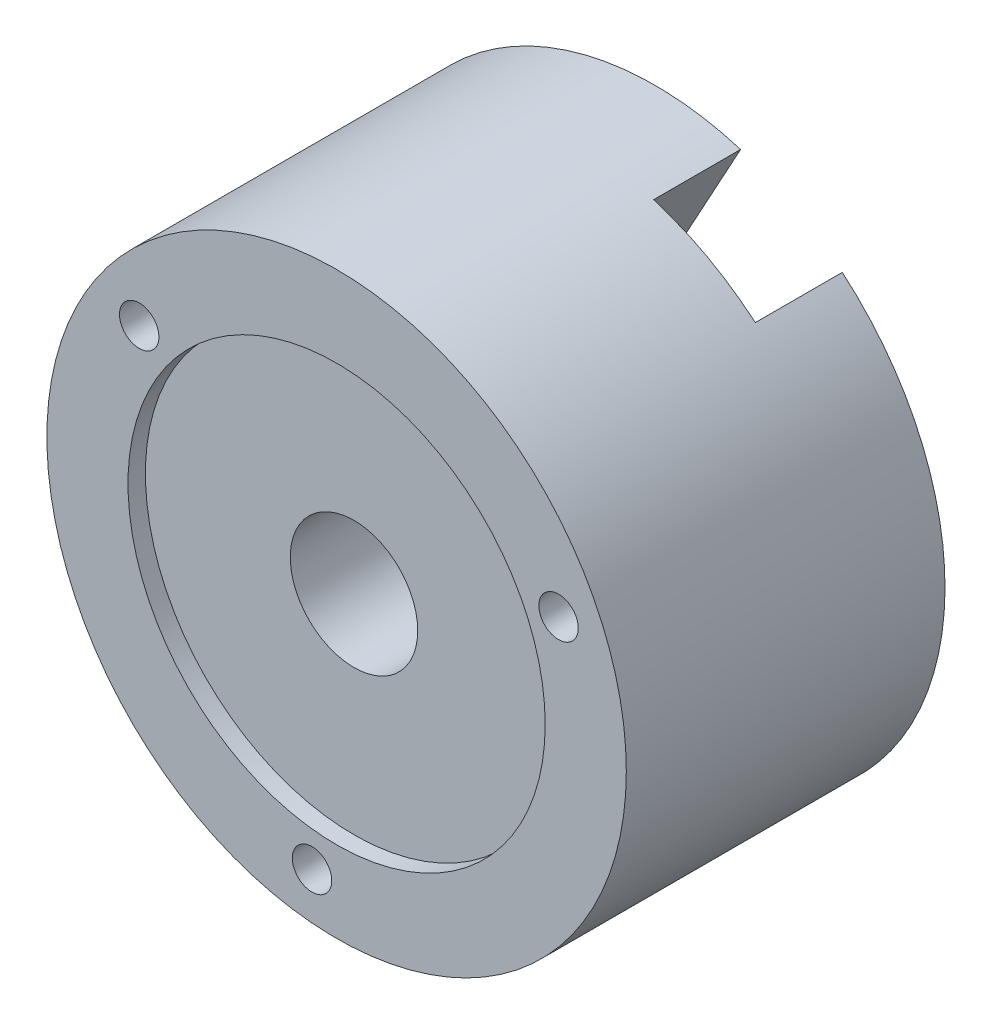
ISO-10303-21;
HEADER;
FILE_DESCRIPTION(('STEP AP214'),'2;1');
FILE_NAME('part.step','',(''),(''),'','','');
FILE_SCHEMA(('AUTOMOTIVE_DESIGN { 1 0 10303 214 1 1 1 1 }'));
ENDSEC;
DATA;
#1=APPLICATION_CONTEXT('core data for automotive mechanical design processes');
#2=APPLICATION_PROTOCOL_DEFINITION('international standard','automotive_design',2000,#1);
#3=PRODUCT_CONTEXT('',#1,'mechanical');
#4=PRODUCT('Part','Part','',(#3));
#5=PRODUCT_RELATED_PRODUCT_CATEGORY('part','',(#4));
#6=PRODUCT_DEFINITION_FORMATION('','',#4);
#7=PRODUCT_DEFINITION_CONTEXT('part definition',#1,'design');
#8=PRODUCT_DEFINITION('design','',#6,#7);
#9=PRODUCT_DEFINITION_SHAPE('','',#8);
#10=(LENGTH_UNIT() NAMED_UNIT(*) SI_UNIT(.MILLI.,.METRE.));
#11=(NAMED_UNIT(*) PLANE_ANGLE_UNIT() SI_UNIT($,.RADIAN.));
#12=(NAMED_UNIT(*) SI_UNIT($,.STERADIAN.) SOLID_ANGLE_UNIT());
#13=UNCERTAINTY_MEASURE_WITH_UNIT(LENGTH_MEASURE(1.E-05),#10,'distance_accuracy_value','');
#14=(GEOMETRIC_REPRESENTATION_CONTEXT(3) GLOBAL_UNCERTAINTY_ASSIGNED_CONTEXT((#13)) GLOBAL_UNIT_ASSIGNED_CONTEXT((#10,
#11,#12)) REPRESENTATION_CONTEXT('',''));
#15=CARTESIAN_POINT('',(0.,0.,0.));
#16=DIRECTION('',(0.,0.,1.));
#17=DIRECTION('',(1.,0.,0.));
#18=AXIS2_PLACEMENT_3D('',#15,#16,#17);
#19=CARTESIAN_POINT('',(0.,0.,0.));
#20=DIRECTION('',(0.,0.,1.));
#21=DIRECTION('',(1.,0.,0.));
#22=AXIS2_PLACEMENT_3D('',#19,#20,#21);
#23=PLANE('',#22);
#24=CARTESIAN_POINT('',(0.,0.,0.));
#25=DIRECTION('',(0.,0.,1.));
#26=DIRECTION('',(1.,0.,0.));
#27=AXIS2_PLACEMENT_3D('',#24,#25,#26);
#28=CIRCLE('',#27,50.);
#29=CARTESIAN_POINT('',(34.0235840809207,-36.6387189498831,0.));
#30=VERTEX_POINT('',#29);
#31=CARTESIAN_POINT('',(32.2684884576599,38.1935158457279,0.));
#32=VERTEX_POINT('',#31);
#33=EDGE_CURVE('E208',#30,#32,#28,.T.);
#34=ORIENTED_EDGE('',*,*,#33,.F.);
#35=DIRECTION('',(0.520168485951958,-0.854063666375317,0.));
#36=VECTOR('',#35,1.);
#37=CARTESIAN_POINT('',(60.5574852589489,-80.2046817780121,0.));
#38=LINE('',#37,#36);
#39=CARTESIAN_POINT('',(11.5438308176364,0.270745982650838,0.));
#40=VERTEX_POINT('',#39);
#41=EDGE_CURVE('E128',#40,#30,#38,.T.);
#42=ORIENTED_EDGE('',*,*,#41,.F.);
#43=DIRECTION('',(-0.479556588554331,-0.877510956270138,0.));
#44=VECTOR('',#43,1.);
#45=CARTESIAN_POINT('',(56.7307684181345,82.9555297414705,0.));
#46=LINE('',#45,#44);
#47=EDGE_CURVE('E157',#32,#40,#46,.T.);
#48=ORIENTED_EDGE('',*,*,#47,.F.);
#49=EDGE_LOOP('',(#34,#42,#48));
#50=FACE_BOUND('',#49,.T.);
#51=ADVANCED_FACE('F39',(#50),#23,.F.);
#52=CARTESIAN_POINT('',(14.7182693322572,47.7846476168145,0.));
#53=VERTEX_POINT('',#52);
#54=CARTESIAN_POINT('',(-49.2107992110739,8.84857282319423,0.));
#55=VERTEX_POINT('',#54);
#56=EDGE_CURVE('E48',#53,#55,#28,.T.);
#57=ORIENTED_EDGE('',*,*,#56,.F.);
#58=DIRECTION('',(0.479556588554331,0.877510956270138,0.));
#59=VECTOR('',#58,1.);
#60=CARTESIAN_POINT('',(39.1805492927317,92.5466615125571,0.));
#61=LINE('',#60,#59);
#62=CARTESIAN_POINT('',(-6.00638830776638,9.86187775373735,0.));
#63=VERTEX_POINT('',#62);
#64=EDGE_CURVE('E155',#63,#53,#61,.T.);
#65=ORIENTED_EDGE('',*,*,#64,.F.);
#66=DIRECTION('',(0.99972507450628,0.0234472898948206,0.));
#67=VECTOR('',#66,1.);
#68=CARTESIAN_POINT('',(-100.206980349576,7.65252175558071,0.));
#69=LINE('',#68,#67);
#70=EDGE_CURVE('E153',#55,#63,#69,.T.);
#71=ORIENTED_EDGE('',*,*,#70,.F.);
#72=EDGE_LOOP('',(#57,#65,#71));
#73=FACE_BOUND('',#72,.T.);
#74=ADVANCED_FACE('F222',(#73),#23,.F.);
#75=CARTESIAN_POINT('',(0.,0.,-0.001000000000001));
#76=DIRECTION('',(0.,0.,1.));
#77=DIRECTION('',(1.,0.,0.));
#78=AXIS2_PLACEMENT_3D('',#75,#76,#77);
#79=CYLINDRICAL_SURFACE('',#78,11.);
#80=CARTESIAN_POINT('',(0.,0.,52.));
#81=DIRECTION('',(0.,0.,1.));
#82=DIRECTION('',(1.,0.,0.));
#83=AXIS2_PLACEMENT_3D('',#80,#81,#82);
#84=CIRCLE('',#83,11.);
#85=CARTESIAN_POINT('',(11.,0.,52.));
#86=VERTEX_POINT('',#85);
#87=EDGE_CURVE('E201',#86,#86,#84,.T.);
#88=ORIENTED_EDGE('',*,*,#87,.T.);
#89=EDGE_LOOP('',(#88));
#90=FACE_BOUND('',#89,.T.);
#91=CARTESIAN_POINT('',(0.,0.,15.));
#92=DIRECTION('',(0.,0.,-1.));
#93=DIRECTION('',(-1.,0.,0.));
#94=AXIS2_PLACEMENT_3D('',#91,#92,#93);
#95=CIRCLE('',#94,11.);
#96=CARTESIAN_POINT('',(-11.,0.,15.));
#97=VERTEX_POINT('',#96);
#98=EDGE_CURVE('E43',#97,#97,#95,.F.);
#99=ORIENTED_EDGE('',*,*,#98,.F.);
#100=EDGE_LOOP('',(#99));
#101=FACE_BOUND('',#100,.T.);
#102=ADVANCED_FACE('F257',(#90,#101),#79,.F.);
#103=CARTESIAN_POINT('',(0.,0.,55.));
#104=DIRECTION('',(0.,0.,-1.));
#105=DIRECTION('',(-1.,0.,0.));
#106=AXIS2_PLACEMENT_3D('',#103,#104,#105);
#107=CYLINDRICAL_SURFACE('',#106,50.);
#108=ORIENTED_EDGE('',*,*,#33,.T.);
#109=DIRECTION('',(0.,0.,-1.));
#110=VECTOR('',#109,1.);
#111=CARTESIAN_POINT('',(32.2684884576599,38.1935158457279,55.));
#112=LINE('',#111,#110);
#113=CARTESIAN_POINT('',(32.2684884576599,38.1935158457279,15.));
#114=VERTEX_POINT('',#113);
#115=EDGE_CURVE('E175',#32,#114,#112,.F.);
#116=ORIENTED_EDGE('',*,*,#115,.T.);
#117=CARTESIAN_POINT('',(0.,0.,15.));
#118=DIRECTION('',(0.,0.,-1.));
#119=DIRECTION('',(-1.,0.,0.));
#120=AXIS2_PLACEMENT_3D('',#117,#118,#119);
#121=CIRCLE('',#120,50.);
#122=CARTESIAN_POINT('',(14.7182693322572,47.7846476168145,15.));
#123=VERTEX_POINT('',#122);
#124=EDGE_CURVE('E167',#123,#114,#121,.T.);
#125=ORIENTED_EDGE('',*,*,#124,.F.);
#126=DIRECTION('',(0.,0.,-1.));
#127=VECTOR('',#126,1.);
#128=CARTESIAN_POINT('',(14.7182693322572,47.7846476168145,55.));
#129=LINE('',#128,#127);
#130=EDGE_CURVE('E172',#123,#53,#129,.T.);
#131=ORIENTED_EDGE('',*,*,#130,.T.);
#132=ORIENTED_EDGE('',*,*,#56,.T.);
#133=DIRECTION('',(0.,0.,-1.));
#134=VECTOR('',#133,1.);
#135=CARTESIAN_POINT('',(-49.2107992110739,8.84857282319423,55.));
#136=LINE('',#135,#134);
#137=CARTESIAN_POINT('',(-49.2107992110739,8.84857282319423,15.));
#138=VERTEX_POINT('',#137);
#139=EDGE_CURVE('E169',#55,#138,#136,.F.);
#140=ORIENTED_EDGE('',*,*,#139,.T.);
#141=CARTESIAN_POINT('',(-48.7418534131775,-11.1459286669314,15.));
#142=VERTEX_POINT('',#141);
#143=EDGE_CURVE('E165',#142,#138,#121,.T.);
#144=ORIENTED_EDGE('',*,*,#143,.F.);
#145=DIRECTION('',(0.,0.,-1.));
#146=VECTOR('',#145,1.);
#147=CARTESIAN_POINT('',(-48.7418534131774,-11.1459286669314,55.));
#148=LINE('',#147,#146);
#149=CARTESIAN_POINT('',(-48.7418534131775,-11.1459286669314,0.));
#150=VERTEX_POINT('',#149);
#151=EDGE_CURVE('E139',#142,#150,#148,.T.);
#152=ORIENTED_EDGE('',*,*,#151,.T.);
#153=CARTESIAN_POINT('',(16.9423107534144,-47.0420886689222,0.));
#154=VERTEX_POINT('',#153);
#155=EDGE_CURVE('E211',#150,#154,#28,.T.);
#156=ORIENTED_EDGE('',*,*,#155,.T.);
#157=DIRECTION('',(0.,0.,-1.));
#158=VECTOR('',#157,1.);
#159=CARTESIAN_POINT('',(16.9423107534143,-47.0420886689222,55.));
#160=LINE('',#159,#158);
#161=CARTESIAN_POINT('',(16.9423107534143,-47.0420886689222,15.));
#162=VERTEX_POINT('',#161);
#163=EDGE_CURVE('E181',#154,#162,#160,.F.);
#164=ORIENTED_EDGE('',*,*,#163,.T.);
#165=CARTESIAN_POINT('',(34.0235840809207,-36.6387189498831,15.));
#166=VERTEX_POINT('',#165);
#167=EDGE_CURVE('E125',#166,#162,#121,.T.);
#168=ORIENTED_EDGE('',*,*,#167,.F.);
#169=DIRECTION('',(0.,0.,-1.));
#170=VECTOR('',#169,1.);
#171=CARTESIAN_POINT('',(34.0235840809207,-36.6387189498831,55.));
#172=LINE('',#171,#170);
#173=EDGE_CURVE('E178',#166,#30,#172,.T.);
#174=ORIENTED_EDGE('',*,*,#173,.T.);
#175=EDGE_LOOP('',(#108,#116,#125,#131,#132,#140,#144,#152,#156,#164,#168,#174));
#176=FACE_BOUND('',#175,.T.);
#177=CARTESIAN_POINT('',(0.,0.,55.));
#178=DIRECTION('',(0.,0.,1.));
#179=DIRECTION('',(1.,0.,0.));
#180=AXIS2_PLACEMENT_3D('',#177,#178,#179);
#181=CIRCLE('',#180,50.);
#182=CARTESIAN_POINT('',(50.,0.,55.));
#183=VERTEX_POINT('',#182);
#184=EDGE_CURVE('E11',#183,#183,#181,.T.);
#185=ORIENTED_EDGE('',*,*,#184,.F.);
#186=EDGE_LOOP('',(#185));
#187=FACE_BOUND('',#186,.T.);
#188=ADVANCED_FACE('F41',(#176,#187),#107,.T.);
#189=CARTESIAN_POINT('',(0.,0.,55.));
#190=DIRECTION('',(0.,0.,1.));
#191=DIRECTION('',(1.,0.,0.));
#192=AXIS2_PLACEMENT_3D('',#189,#190,#191);
#193=PLANE('',#192);
#194=CARTESIAN_POINT('',(-34.0686775954448,24.5626791473902,55.));
#195=DIRECTION('',(0.,0.,1.));
#196=DIRECTION('',(1.,0.,0.));
#197=AXIS2_PLACEMENT_3D('',#194,#195,#196);
#198=CIRCLE('',#197,3.39999999999999);
#199=CARTESIAN_POINT('',(-30.6686775954448,24.5626791473902,55.));
#200=VERTEX_POINT('',#199);
#201=EDGE_CURVE('E183',#200,#200,#198,.T.);
#202=ORIENTED_EDGE('',*,*,#201,.F.);
#203=EDGE_LOOP('',(#202));
#204=FACE_BOUND('',#203,.T.);
#205=CARTESIAN_POINT('',(38.3062429243689,17.2230006973048,55.));
#206=DIRECTION('',(0.,0.,1.));
#207=DIRECTION('',(1.,0.,0.));
#208=AXIS2_PLACEMENT_3D('',#205,#206,#207);
#209=CIRCLE('',#208,3.39999999999999);
#210=CARTESIAN_POINT('',(41.7062429243689,17.2230006973048,55.));
#211=VERTEX_POINT('',#210);
#212=EDGE_CURVE('E189',#211,#211,#209,.T.);
#213=ORIENTED_EDGE('',*,*,#212,.F.);
#214=EDGE_LOOP('',(#213));
#215=FACE_BOUND('',#214,.T.);
#216=CARTESIAN_POINT('',(-4.23756532892108,-41.7856798446908,55.));
#217=DIRECTION('',(0.,0.,1.));
#218=DIRECTION('',(1.,0.,0.));
#219=AXIS2_PLACEMENT_3D('',#216,#217,#218);
#220=CIRCLE('',#219,3.39999999999999);
#221=CARTESIAN_POINT('',(-0.837565328921088,-41.7856798446908,55.));
#222=VERTEX_POINT('',#221);
#223=EDGE_CURVE('E195',#222,#222,#220,.T.);
#224=ORIENTED_EDGE('',*,*,#223,.F.);
#225=EDGE_LOOP('',(#224));
#226=FACE_BOUND('',#225,.T.);
#227=CARTESIAN_POINT('',(0.,0.,55.));
#228=DIRECTION('',(0.,0.,1.));
#229=DIRECTION('',(1.,0.,0.));
#230=AXIS2_PLACEMENT_3D('',#227,#228,#229);
#231=CIRCLE('',#230,36.);
#232=CARTESIAN_POINT('',(36.,0.,55.));
#233=VERTEX_POINT('',#232);
#234=EDGE_CURVE('E204',#233,#233,#231,.T.);
#235=ORIENTED_EDGE('',*,*,#234,.F.);
#236=EDGE_LOOP('',(#235));
#237=FACE_BOUND('',#236,.T.);
#238=ORIENTED_EDGE('',*,*,#184,.T.);
#239=EDGE_LOOP('',(#238));
#240=FACE_BOUND('',#239,.T.);
#241=ADVANCED_FACE('F245',(#204,#215,#226,#237,#240),#193,.T.);
#242=DIRECTION('',(-0.999725074506281,-0.0234472898948211,0.));
#243=VECTOR('',#242,1.);
#244=CARTESIAN_POINT('',(-99.7380345516799,-12.3419797345449,0.));
#245=LINE('',#244,#243);
#246=CARTESIAN_POINT('',(-5.53744250986993,-10.1326237363882,0.));
#247=VERTEX_POINT('',#246);
#248=EDGE_CURVE('E151',#247,#150,#245,.T.);
#249=ORIENTED_EDGE('',*,*,#248,.F.);
#250=DIRECTION('',(-0.520168485951957,0.854063666375317,0.));
#251=VECTOR('',#250,1.);
#252=CARTESIAN_POINT('',(43.4762119314426,-90.6080514970512,0.));
#253=LINE('',#252,#251);
#254=EDGE_CURVE('E132',#154,#247,#253,.T.);
#255=ORIENTED_EDGE('',*,*,#254,.F.);
#256=ORIENTED_EDGE('',*,*,#155,.F.);
#257=EDGE_LOOP('',(#249,#255,#256));
#258=FACE_BOUND('',#257,.T.);
#259=ADVANCED_FACE('F242',(#258),#23,.F.);
#260=CARTESIAN_POINT('',(0.,0.,52.));
#261=DIRECTION('',(0.,0.,1.));
#262=DIRECTION('',(1.,0.,0.));
#263=AXIS2_PLACEMENT_3D('',#260,#261,#262);
#264=CYLINDRICAL_SURFACE('',#263,36.);
#265=CARTESIAN_POINT('',(0.,0.,52.));
#266=DIRECTION('',(0.,0.,1.));
#267=DIRECTION('',(1.,0.,0.));
#268=AXIS2_PLACEMENT_3D('',#265,#266,#267);
#269=CIRCLE('',#268,36.);
#270=CARTESIAN_POINT('',(36.,0.,52.));
#271=VERTEX_POINT('',#270);
#272=EDGE_CURVE('E205',#271,#271,#269,.T.);
#273=ORIENTED_EDGE('',*,*,#272,.F.);
#274=EDGE_LOOP('',(#273));
#275=FACE_BOUND('',#274,.T.);
#276=ORIENTED_EDGE('',*,*,#234,.T.);
#277=EDGE_LOOP('',(#276));
#278=FACE_BOUND('',#277,.T.);
#279=ADVANCED_FACE('F244',(#275,#278),#264,.F.);
#280=CARTESIAN_POINT('',(0.,0.,52.));
#281=DIRECTION('',(0.,0.,1.));
#282=DIRECTION('',(1.,0.,0.));
#283=AXIS2_PLACEMENT_3D('',#280,#281,#282);
#284=PLANE('',#283);
#285=ORIENTED_EDGE('',*,*,#87,.F.);
#286=EDGE_LOOP('',(#285));
#287=FACE_BOUND('',#286,.T.);
#288=ORIENTED_EDGE('',*,*,#272,.T.);
#289=EDGE_LOOP('',(#288));
#290=FACE_BOUND('',#289,.T.);
#291=ADVANCED_FACE('F250',(#287,#290),#284,.T.);
#292=CARTESIAN_POINT('',(-4.23756532892108,-41.7856798446908,44.75));
#293=DIRECTION('',(0.,0.,1.));
#294=DIRECTION('',(1.,0.,0.));
#295=AXIS2_PLACEMENT_3D('',#292,#293,#294);
#296=CONICAL_SURFACE('',#295,3.4,1.02974425867666);
#297=CARTESIAN_POINT('',(-4.23756532892108,-41.7856798446908,42.7070738953063));
#298=VERTEX_POINT('',#297);
#299=VERTEX_LOOP('',#298);
#300=FACE_BOUND('',#299,.T.);
#301=CARTESIAN_POINT('',(-4.23756532892108,-41.7856798446908,44.75));
#302=DIRECTION('',(0.,0.,1.));
#303=DIRECTION('',(1.,0.,0.));
#304=AXIS2_PLACEMENT_3D('',#301,#302,#303);
#305=CIRCLE('',#304,3.4);
#306=CARTESIAN_POINT('',(-0.83756532892108,-41.7856798446908,44.75));
#307=VERTEX_POINT('',#306);
#308=EDGE_CURVE('E198',#307,#307,#305,.T.);
#309=ORIENTED_EDGE('',*,*,#308,.T.);
#310=EDGE_LOOP('',(#309));
#311=FACE_BOUND('',#310,.T.);
#312=ADVANCED_FACE('F269',(#300,#311),#296,.F.);
#313=CARTESIAN_POINT('',(-4.23756532892108,-41.7856798446908,55.));
#314=DIRECTION('',(0.,0.,1.));
#315=DIRECTION('',(1.,0.,0.));
#316=AXIS2_PLACEMENT_3D('',#313,#314,#315);
#317=CYLINDRICAL_SURFACE('',#316,3.39999999999999);
#318=ORIENTED_EDGE('',*,*,#308,.F.);
#319=EDGE_LOOP('',(#318));
#320=FACE_BOUND('',#319,.T.);
#321=ORIENTED_EDGE('',*,*,#223,.T.);
#322=EDGE_LOOP('',(#321));
#323=FACE_BOUND('',#322,.T.);
#324=ADVANCED_FACE('F276',(#320,#323),#317,.F.);
#325=CARTESIAN_POINT('',(38.3062429243689,17.2230006973048,44.75));
#326=DIRECTION('',(0.,0.,1.));
#327=DIRECTION('',(1.,0.,0.));
#328=AXIS2_PLACEMENT_3D('',#325,#326,#327);
#329=CONICAL_SURFACE('',#328,3.4,1.02974425867666);
#330=CARTESIAN_POINT('',(38.3062429243689,17.2230006973048,42.7070738953063));
#331=VERTEX_POINT('',#330);
#332=VERTEX_LOOP('',#331);
#333=FACE_BOUND('',#332,.T.);
#334=CARTESIAN_POINT('',(38.3062429243689,17.2230006973048,44.75));
#335=DIRECTION('',(0.,0.,1.));
#336=DIRECTION('',(1.,0.,0.));
#337=AXIS2_PLACEMENT_3D('',#334,#335,#336);
#338=CIRCLE('',#337,3.4);
#339=CARTESIAN_POINT('',(41.7062429243689,17.2230006973048,44.75));
#340=VERTEX_POINT('',#339);
#341=EDGE_CURVE('E192',#340,#340,#338,.T.);
#342=ORIENTED_EDGE('',*,*,#341,.T.);
#343=EDGE_LOOP('',(#342));
#344=FACE_BOUND('',#343,.T.);
#345=ADVANCED_FACE('F288',(#333,#344),#329,.F.);
#346=CARTESIAN_POINT('',(38.3062429243689,17.2230006973048,55.));
#347=DIRECTION('',(0.,0.,1.));
#348=DIRECTION('',(1.,0.,0.));
#349=AXIS2_PLACEMENT_3D('',#346,#347,#348);
#350=CYLINDRICAL_SURFACE('',#349,3.39999999999999);
#351=ORIENTED_EDGE('',*,*,#341,.F.);
#352=EDGE_LOOP('',(#351));
#353=FACE_BOUND('',#352,.T.);
#354=ORIENTED_EDGE('',*,*,#212,.T.);
#355=EDGE_LOOP('',(#354));
#356=FACE_BOUND('',#355,.T.);
#357=ADVANCED_FACE('F298',(#353,#356),#350,.F.);
#358=CARTESIAN_POINT('',(-34.0686775954448,24.5626791473902,44.75));
#359=DIRECTION('',(0.,0.,1.));
#360=DIRECTION('',(1.,0.,0.));
#361=AXIS2_PLACEMENT_3D('',#358,#359,#360);
#362=CONICAL_SURFACE('',#361,3.4,1.02974425867666);
#363=CARTESIAN_POINT('',(-34.0686775954448,24.5626791473902,42.7070738953063));
#364=VERTEX_POINT('',#363);
#365=VERTEX_LOOP('',#364);
#366=FACE_BOUND('',#365,.T.);
#367=CARTESIAN_POINT('',(-34.0686775954448,24.5626791473902,44.75));
#368=DIRECTION('',(0.,0.,1.));
#369=DIRECTION('',(1.,0.,0.));
#370=AXIS2_PLACEMENT_3D('',#367,#368,#369);
#371=CIRCLE('',#370,3.4);
#372=CARTESIAN_POINT('',(-30.6686775954448,24.5626791473902,44.75));
#373=VERTEX_POINT('',#372);
#374=EDGE_CURVE('E186',#373,#373,#371,.T.);
#375=ORIENTED_EDGE('',*,*,#374,.T.);
#376=EDGE_LOOP('',(#375));
#377=FACE_BOUND('',#376,.T.);
#378=ADVANCED_FACE('F304',(#366,#377),#362,.F.);
#379=CARTESIAN_POINT('',(-34.0686775954448,24.5626791473902,55.));
#380=DIRECTION('',(0.,0.,1.));
#381=DIRECTION('',(1.,0.,0.));
#382=AXIS2_PLACEMENT_3D('',#379,#380,#381);
#383=CYLINDRICAL_SURFACE('',#382,3.39999999999999);
#384=ORIENTED_EDGE('',*,*,#374,.F.);
#385=EDGE_LOOP('',(#384));
#386=FACE_BOUND('',#385,.T.);
#387=ORIENTED_EDGE('',*,*,#201,.T.);
#388=EDGE_LOOP('',(#387));
#389=FACE_BOUND('',#388,.T.);
#390=ADVANCED_FACE('F308',(#386,#389),#383,.F.);
#391=CARTESIAN_POINT('',(43.4762119314426,-90.6080514970512,15.));
#392=DIRECTION('',(-0.854063666375317,-0.520168485951957,0.));
#393=DIRECTION('',(0.520168485951957,-0.854063666375317,0.));
#394=AXIS2_PLACEMENT_3D('',#391,#392,#393);
#395=PLANE('',#394);
#396=ORIENTED_EDGE('',*,*,#254,.T.);
#397=DIRECTION('',(0.,0.,-1.));
#398=VECTOR('',#397,1.);
#399=CARTESIAN_POINT('',(-5.53744250986993,-10.1326237363882,15.));
#400=LINE('',#399,#398);
#401=CARTESIAN_POINT('',(-5.53744250986993,-10.1326237363882,15.));
#402=VERTEX_POINT('',#401);
#403=EDGE_CURVE('E56',#402,#247,#400,.T.);
#404=ORIENTED_EDGE('',*,*,#403,.F.);
#405=DIRECTION('',(-0.520168485951957,0.854063666375317,0.));
#406=VECTOR('',#405,1.);
#407=CARTESIAN_POINT('',(43.4762119314426,-90.6080514970512,15.));
#408=LINE('',#407,#406);
#409=EDGE_CURVE('E119',#162,#402,#408,.T.);
#410=ORIENTED_EDGE('',*,*,#409,.F.);
#411=ORIENTED_EDGE('',*,*,#163,.F.);
#412=EDGE_LOOP('',(#396,#404,#410,#411));
#413=FACE_BOUND('',#412,.T.);
#414=ADVANCED_FACE('F130',(#413),#395,.F.);
#415=CARTESIAN_POINT('',(60.5574852589489,-80.2046817780121,15.));
#416=DIRECTION('',(0.854063666375317,0.520168485951958,0.));
#417=DIRECTION('',(-0.520168485951958,0.854063666375317,0.));
#418=AXIS2_PLACEMENT_3D('',#415,#416,#417);
#419=PLANE('',#418);
#420=DIRECTION('',(0.520168485951958,-0.854063666375317,0.));
#421=VECTOR('',#420,1.);
#422=CARTESIAN_POINT('',(60.5574852589489,-80.2046817780121,15.));
#423=LINE('',#422,#421);
#424=CARTESIAN_POINT('',(11.5438308176364,0.270745982650838,15.));
#425=VERTEX_POINT('',#424);
#426=EDGE_CURVE('E135',#425,#166,#423,.T.);
#427=ORIENTED_EDGE('',*,*,#426,.F.);
#428=DIRECTION('',(0.,0.,-1.));
#429=VECTOR('',#428,1.);
#430=CARTESIAN_POINT('',(11.5438308176364,0.270745982650838,15.));
#431=LINE('',#430,#429);
#432=EDGE_CURVE('E160',#425,#40,#431,.T.);
#433=ORIENTED_EDGE('',*,*,#432,.T.);
#434=ORIENTED_EDGE('',*,*,#41,.T.);
#435=ORIENTED_EDGE('',*,*,#173,.F.);
#436=EDGE_LOOP('',(#427,#433,#434,#435));
#437=FACE_BOUND('',#436,.T.);
#438=ADVANCED_FACE('F239',(#437),#419,.F.);
#439=CARTESIAN_POINT('',(56.7307684181345,82.9555297414705,15.));
#440=DIRECTION('',(0.877510956270138,-0.479556588554331,0.));
#441=DIRECTION('',(0.479556588554331,0.877510956270138,0.));
#442=AXIS2_PLACEMENT_3D('',#439,#440,#441);
#443=PLANE('',#442);
#444=ORIENTED_EDGE('',*,*,#47,.T.);
#445=ORIENTED_EDGE('',*,*,#432,.F.);
#446=DIRECTION('',(-0.479556588554331,-0.877510956270138,0.));
#447=VECTOR('',#446,1.);
#448=CARTESIAN_POINT('',(56.7307684181345,82.9555297414705,15.));
#449=LINE('',#448,#447);
#450=EDGE_CURVE('E147',#114,#425,#449,.T.);
#451=ORIENTED_EDGE('',*,*,#450,.F.);
#452=ORIENTED_EDGE('',*,*,#115,.F.);
#453=EDGE_LOOP('',(#444,#445,#451,#452));
#454=FACE_BOUND('',#453,.T.);
#455=ADVANCED_FACE('F233',(#454),#443,.F.);
#456=CARTESIAN_POINT('',(39.1805492927317,92.5466615125571,15.));
#457=DIRECTION('',(-0.877510956270138,0.479556588554331,0.));
#458=DIRECTION('',(-0.479556588554331,-0.877510956270138,0.));
#459=AXIS2_PLACEMENT_3D('',#456,#457,#458);
#460=PLANE('',#459);
#461=DIRECTION('',(0.479556588554331,0.877510956270138,0.));
#462=VECTOR('',#461,1.);
#463=CARTESIAN_POINT('',(39.1805492927317,92.5466615125571,15.));
#464=LINE('',#463,#462);
#465=CARTESIAN_POINT('',(-6.00638830776638,9.86187775373735,15.));
#466=VERTEX_POINT('',#465);
#467=EDGE_CURVE('E142',#466,#123,#464,.T.);
#468=ORIENTED_EDGE('',*,*,#467,.F.);
#469=DIRECTION('',(0.,0.,-1.));
#470=VECTOR('',#469,1.);
#471=CARTESIAN_POINT('',(-6.00638830776638,9.86187775373735,15.));
#472=LINE('',#471,#470);
#473=EDGE_CURVE('E134',#466,#63,#472,.T.);
#474=ORIENTED_EDGE('',*,*,#473,.T.);
#475=ORIENTED_EDGE('',*,*,#64,.T.);
#476=ORIENTED_EDGE('',*,*,#130,.F.);
#477=EDGE_LOOP('',(#468,#474,#475,#476));
#478=FACE_BOUND('',#477,.T.);
#479=ADVANCED_FACE('F229',(#478),#460,.F.);
#480=CARTESIAN_POINT('',(-100.206980349576,7.65252175558071,15.));
#481=DIRECTION('',(-0.0234472898948206,0.999725074506281,0.));
#482=DIRECTION('',(-0.999725074506281,-0.0234472898948206,0.));
#483=AXIS2_PLACEMENT_3D('',#480,#481,#482);
#484=PLANE('',#483);
#485=ORIENTED_EDGE('',*,*,#70,.T.);
#486=ORIENTED_EDGE('',*,*,#473,.F.);
#487=DIRECTION('',(0.99972507450628,0.0234472898948206,0.));
#488=VECTOR('',#487,1.);
#489=CARTESIAN_POINT('',(-100.206980349576,7.65252175558071,15.));
#490=LINE('',#489,#488);
#491=EDGE_CURVE('E140',#138,#466,#490,.T.);
#492=ORIENTED_EDGE('',*,*,#491,.F.);
#493=ORIENTED_EDGE('',*,*,#139,.F.);
#494=EDGE_LOOP('',(#485,#486,#492,#493));
#495=FACE_BOUND('',#494,.T.);
#496=ADVANCED_FACE('F225',(#495),#484,.F.);
#497=CARTESIAN_POINT('',(-99.7380345516799,-12.3419797345449,15.));
#498=DIRECTION('',(0.0234472898948211,-0.99972507450628,0.));
#499=DIRECTION('',(0.999725074506281,0.0234472898948211,0.));
#500=AXIS2_PLACEMENT_3D('',#497,#498,#499);
#501=PLANE('',#500);
#502=DIRECTION('',(-0.999725074506281,-0.0234472898948211,0.));
#503=VECTOR('',#502,1.);
#504=CARTESIAN_POINT('',(-99.7380345516799,-12.3419797345449,15.));
#505=LINE('',#504,#503);
#506=EDGE_CURVE('E121',#402,#142,#505,.T.);
#507=ORIENTED_EDGE('',*,*,#506,.F.);
#508=ORIENTED_EDGE('',*,*,#403,.T.);
#509=ORIENTED_EDGE('',*,*,#248,.T.);
#510=ORIENTED_EDGE('',*,*,#151,.F.);
#511=EDGE_LOOP('',(#507,#508,#509,#510));
#512=FACE_BOUND('',#511,.T.);
#513=ADVANCED_FACE('F137',(#512),#501,.F.);
#514=CARTESIAN_POINT('',(0.,0.,15.));
#515=DIRECTION('',(0.,0.,-1.));
#516=DIRECTION('',(-1.,0.,0.));
#517=AXIS2_PLACEMENT_3D('',#514,#515,#516);
#518=PLANE('',#517);
#519=ORIENTED_EDGE('',*,*,#98,.T.);
#520=EDGE_LOOP('',(#519));
#521=FACE_BOUND('',#520,.T.);
#522=ORIENTED_EDGE('',*,*,#124,.T.);
#523=ORIENTED_EDGE('',*,*,#450,.T.);
#524=ORIENTED_EDGE('',*,*,#426,.T.);
#525=ORIENTED_EDGE('',*,*,#167,.T.);
#526=ORIENTED_EDGE('',*,*,#409,.T.);
#527=ORIENTED_EDGE('',*,*,#506,.T.);
#528=ORIENTED_EDGE('',*,*,#143,.T.);
#529=ORIENTED_EDGE('',*,*,#491,.T.);
#530=ORIENTED_EDGE('',*,*,#467,.T.);
#531=EDGE_LOOP('',(#522,#523,#524,#525,#526,#527,#528,#529,#530));
#532=FACE_BOUND('',#531,.T.);
#533=ADVANCED_FACE('F120',(#521,#532),#518,.T.);
#534=CLOSED_SHELL('',(#51,#74,#102,#188,#241,#259,#279,#291,#312,#324,#345,#357,#378,#390,#414,
#438,#455,#479,#496,#513,#533));
#535=MANIFOLD_SOLID_BREP('B2',#534);
#536=ADVANCED_BREP_SHAPE_REPRESENTATION('',(#18,#535),#14);
#537=SHAPE_DEFINITION_REPRESENTATION(#9,#536);
ENDSEC;
END-ISO-10303-21;
